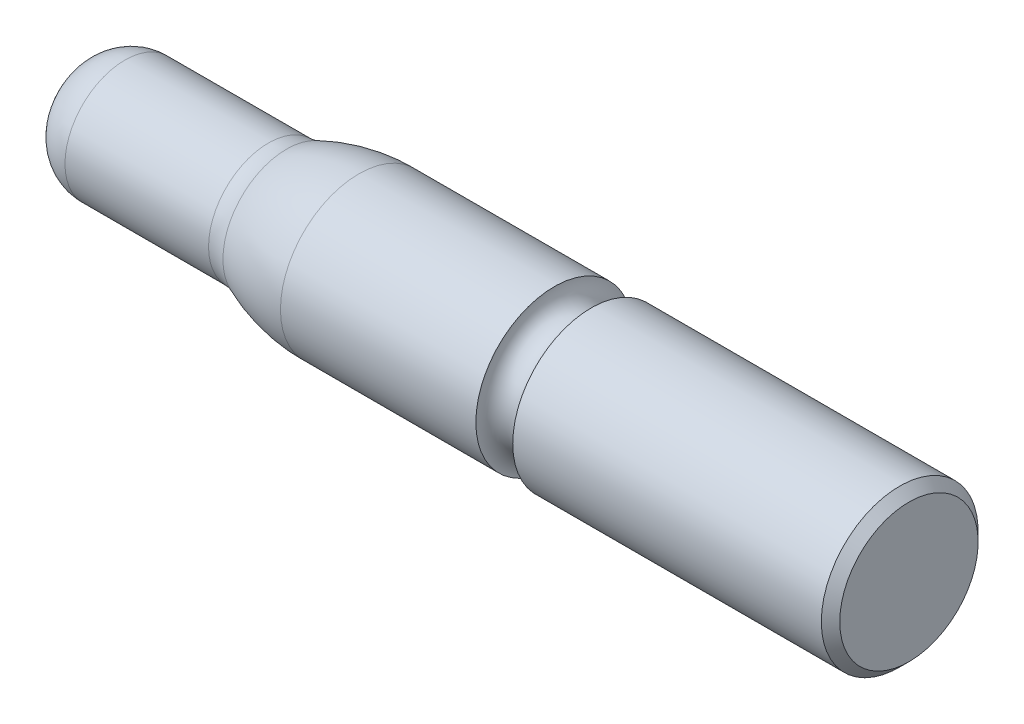
ISO-10303-21;
HEADER;
FILE_DESCRIPTION(('STEP AP214'),'2;1');
FILE_NAME('part.step','',(''),(''),'','','');
FILE_SCHEMA(('AUTOMOTIVE_DESIGN { 1 0 10303 214 1 1 1 1 }'));
ENDSEC;
DATA;
#1=APPLICATION_CONTEXT('core data for automotive mechanical design processes');
#2=APPLICATION_PROTOCOL_DEFINITION('international standard','automotive_design',2000,#1);
#3=PRODUCT_CONTEXT('',#1,'mechanical');
#4=PRODUCT('Part','Part','',(#3));
#5=PRODUCT_RELATED_PRODUCT_CATEGORY('part','',(#4));
#6=PRODUCT_DEFINITION_FORMATION('','',#4);
#7=PRODUCT_DEFINITION_CONTEXT('part definition',#1,'design');
#8=PRODUCT_DEFINITION('design','',#6,#7);
#9=PRODUCT_DEFINITION_SHAPE('','',#8);
#10=(LENGTH_UNIT() NAMED_UNIT(*) SI_UNIT(.MILLI.,.METRE.));
#11=(NAMED_UNIT(*) PLANE_ANGLE_UNIT() SI_UNIT($,.RADIAN.));
#12=(NAMED_UNIT(*) SI_UNIT($,.STERADIAN.) SOLID_ANGLE_UNIT());
#13=UNCERTAINTY_MEASURE_WITH_UNIT(LENGTH_MEASURE(1.E-05),#10,'distance_accuracy_value','');
#14=(GEOMETRIC_REPRESENTATION_CONTEXT(3) GLOBAL_UNCERTAINTY_ASSIGNED_CONTEXT((#13)) GLOBAL_UNIT_ASSIGNED_CONTEXT((#10,
#11,#12)) REPRESENTATION_CONTEXT('',''));
#15=CARTESIAN_POINT('',(0.,0.,0.));
#16=DIRECTION('',(0.,0.,1.));
#17=DIRECTION('',(1.,0.,0.));
#18=AXIS2_PLACEMENT_3D('',#15,#16,#17);
#19=CARTESIAN_POINT('',(-31.4315244509485,13.,0.));
#20=DIRECTION('',(1.,0.,0.));
#21=DIRECTION('',(0.,0.,-1.));
#22=AXIS2_PLACEMENT_3D('',#19,#20,#21);
#23=PLANE('',#22);
#24=CARTESIAN_POINT('',(-31.4315244509485,0.,0.));
#25=DIRECTION('',(1.,0.,0.));
#26=DIRECTION('',(0.,0.,-1.));
#27=AXIS2_PLACEMENT_3D('',#24,#25,#26);
#28=CIRCLE('',#27,2.99999999999999);
#29=CARTESIAN_POINT('',(-31.4315244509485,0.,-2.99999999999999));
#30=VERTEX_POINT('',#29);
#31=EDGE_CURVE('E44',#30,#30,#28,.F.);
#32=ORIENTED_EDGE('',*,*,#31,.T.);
#33=EDGE_LOOP('',(#32));
#34=FACE_BOUND('',#33,.T.);
#35=ADVANCED_FACE('F32',(#34),#23,.F.);
#36=CARTESIAN_POINT('',(0.,0.,0.));
#37=DIRECTION('',(-1.,0.,0.));
#38=DIRECTION('',(0.,0.,1.));
#39=AXIS2_PLACEMENT_3D('',#36,#37,#38);
#40=CYLINDRICAL_SURFACE('',#39,13.);
#41=CARTESIAN_POINT('',(9.69771770373363,0.,0.));
#42=DIRECTION('',(-1.,0.,0.));
#43=DIRECTION('',(0.,0.,1.));
#44=AXIS2_PLACEMENT_3D('',#41,#42,#43);
#45=CIRCLE('',#44,13.);
#46=CARTESIAN_POINT('',(9.69771770373363,0.,13.));
#47=VERTEX_POINT('',#46);
#48=EDGE_CURVE('E53',#47,#47,#45,.T.);
#49=ORIENTED_EDGE('',*,*,#48,.T.);
#50=EDGE_LOOP('',(#49));
#51=FACE_BOUND('',#50,.T.);
#52=CARTESIAN_POINT('',(-21.4315244509485,0.,0.));
#53=DIRECTION('',(1.,0.,0.));
#54=DIRECTION('',(0.,0.,-1.));
#55=AXIS2_PLACEMENT_3D('',#52,#53,#54);
#56=CIRCLE('',#55,13.);
#57=CARTESIAN_POINT('',(-21.4315244509485,0.,-13.));
#58=VERTEX_POINT('',#57);
#59=EDGE_CURVE('E56',#58,#58,#56,.T.);
#60=ORIENTED_EDGE('',*,*,#59,.T.);
#61=EDGE_LOOP('',(#60));
#62=FACE_BOUND('',#61,.T.);
#63=ADVANCED_FACE('F85',(#51,#62),#40,.T.);
#64=CARTESIAN_POINT('',(29.2936356459991,0.,0.));
#65=DIRECTION('',(-1.,0.,0.));
#66=DIRECTION('',(0.,0.,1.));
#67=AXIS2_PLACEMENT_3D('',#64,#65,#66);
#68=DEGENERATE_TOROIDAL_SURFACE('',#67,23.,40.,.F.);
#69=CARTESIAN_POINT('',(13.6169012921867,0.,0.));
#70=DIRECTION('',(1.,0.,0.));
#71=DIRECTION('',(0.,0.,-1.));
#72=AXIS2_PLACEMENT_3D('',#69,#70,#71);
#73=CIRCLE('',#72,13.8);
#74=CARTESIAN_POINT('',(13.6169012921867,0.,-13.8));
#75=VERTEX_POINT('',#74);
#76=EDGE_CURVE('E48',#75,#75,#73,.T.);
#77=ORIENTED_EDGE('',*,*,#76,.T.);
#78=EDGE_LOOP('',(#77));
#79=FACE_BOUND('',#78,.T.);
#80=CARTESIAN_POINT('',(29.2936356459991,0.,0.));
#81=DIRECTION('',(-1.,0.,0.));
#82=DIRECTION('',(0.,0.,1.));
#83=AXIS2_PLACEMENT_3D('',#80,#81,#82);
#84=CIRCLE('',#83,17.);
#85=CARTESIAN_POINT('',(29.2936356459991,0.,17.));
#86=VERTEX_POINT('',#85);
#87=EDGE_CURVE('E59',#86,#86,#84,.T.);
#88=ORIENTED_EDGE('',*,*,#87,.T.);
#89=EDGE_LOOP('',(#88));
#90=FACE_BOUND('',#89,.T.);
#91=ADVANCED_FACE('F91',(#79,#90),#68,.F.);
#92=CARTESIAN_POINT('',(0.,0.,0.));
#93=DIRECTION('',(-1.,0.,0.));
#94=DIRECTION('',(0.,0.,1.));
#95=AXIS2_PLACEMENT_3D('',#92,#93,#94);
#96=CYLINDRICAL_SURFACE('',#95,17.);
#97=ORIENTED_EDGE('',*,*,#87,.F.);
#98=EDGE_LOOP('',(#97));
#99=FACE_BOUND('',#98,.T.);
#100=CARTESIAN_POINT('',(71.6562421661397,0.,0.));
#101=DIRECTION('',(-1.,0.,0.));
#102=DIRECTION('',(0.,0.,1.));
#103=AXIS2_PLACEMENT_3D('',#100,#101,#102);
#104=CIRCLE('',#103,17.);
#105=CARTESIAN_POINT('',(71.6562421661397,0.,17.));
#106=VERTEX_POINT('',#105);
#107=EDGE_CURVE('E62',#106,#106,#104,.T.);
#108=ORIENTED_EDGE('',*,*,#107,.T.);
#109=EDGE_LOOP('',(#108));
#110=FACE_BOUND('',#109,.T.);
#111=ADVANCED_FACE('F81',(#99,#110),#96,.T.);
#112=CARTESIAN_POINT('',(75.6562421661397,0.,0.));
#113=DIRECTION('',(-1.,0.,0.));
#114=DIRECTION('',(0.,0.,1.));
#115=AXIS2_PLACEMENT_3D('',#112,#113,#114);
#116=TOROIDAL_SURFACE('',#115,17.,4.);
#117=ORIENTED_EDGE('',*,*,#107,.F.);
#118=EDGE_LOOP('',(#117));
#119=FACE_BOUND('',#118,.T.);
#120=CARTESIAN_POINT('',(79.6562421661397,0.,0.));
#121=DIRECTION('',(-1.,0.,0.));
#122=DIRECTION('',(0.,0.,1.));
#123=AXIS2_PLACEMENT_3D('',#120,#121,#122);
#124=CIRCLE('',#123,17.);
#125=CARTESIAN_POINT('',(79.6562421661397,0.,17.));
#126=VERTEX_POINT('',#125);
#127=EDGE_CURVE('E65',#126,#126,#124,.T.);
#128=ORIENTED_EDGE('',*,*,#127,.T.);
#129=EDGE_LOOP('',(#128));
#130=FACE_BOUND('',#129,.T.);
#131=ADVANCED_FACE('F69',(#119,#130),#116,.F.);
#132=CARTESIAN_POINT('',(0.,0.,0.));
#133=DIRECTION('',(-1.,0.,0.));
#134=DIRECTION('',(0.,0.,1.));
#135=AXIS2_PLACEMENT_3D('',#132,#133,#134);
#136=CYLINDRICAL_SURFACE('',#135,17.);
#137=CARTESIAN_POINT('',(146.568475549051,0.,0.));
#138=DIRECTION('',(-1.,0.,0.));
#139=DIRECTION('',(0.,0.,1.));
#140=AXIS2_PLACEMENT_3D('',#137,#138,#139);
#141=CIRCLE('',#140,17.);
#142=CARTESIAN_POINT('',(146.568475549051,0.,17.));
#143=VERTEX_POINT('',#142);
#144=EDGE_CURVE('E40',#143,#143,#141,.T.);
#145=ORIENTED_EDGE('',*,*,#144,.T.);
#146=EDGE_LOOP('',(#145));
#147=FACE_BOUND('',#146,.T.);
#148=ORIENTED_EDGE('',*,*,#127,.F.);
#149=EDGE_LOOP('',(#148));
#150=FACE_BOUND('',#149,.T.);
#151=ADVANCED_FACE('F71',(#147,#150),#136,.T.);
#152=CARTESIAN_POINT('',(148.568475549051,17.,0.));
#153=DIRECTION('',(-1.,0.,0.));
#154=DIRECTION('',(0.,0.,1.));
#155=AXIS2_PLACEMENT_3D('',#152,#153,#154);
#156=PLANE('',#155);
#157=CARTESIAN_POINT('',(148.568475549051,0.,0.));
#158=DIRECTION('',(-1.,0.,0.));
#159=DIRECTION('',(0.,0.,1.));
#160=AXIS2_PLACEMENT_3D('',#157,#158,#159);
#161=CIRCLE('',#160,15.);
#162=CARTESIAN_POINT('',(148.568475549051,0.,15.));
#163=VERTEX_POINT('',#162);
#164=EDGE_CURVE('E10',#163,#163,#161,.F.);
#165=ORIENTED_EDGE('',*,*,#164,.T.);
#166=EDGE_LOOP('',(#165));
#167=FACE_BOUND('',#166,.T.);
#168=ADVANCED_FACE('F73',(#167),#156,.F.);
#169=CARTESIAN_POINT('',(9.69771770373363,0.,0.));
#170=DIRECTION('',(-1.,0.,0.));
#171=DIRECTION('',(0.,0.,1.));
#172=AXIS2_PLACEMENT_3D('',#169,#170,#171);
#173=TOROIDAL_SURFACE('',#172,23.,10.);
#174=ORIENTED_EDGE('',*,*,#76,.F.);
#175=EDGE_LOOP('',(#174));
#176=FACE_BOUND('',#175,.T.);
#177=ORIENTED_EDGE('',*,*,#48,.F.);
#178=EDGE_LOOP('',(#177));
#179=FACE_BOUND('',#178,.T.);
#180=ADVANCED_FACE('F79',(#176,#179),#173,.F.);
#181=CARTESIAN_POINT('',(-21.4315244509485,0.,0.));
#182=DIRECTION('',(1.,0.,0.));
#183=DIRECTION('',(0.,0.,-1.));
#184=AXIS2_PLACEMENT_3D('',#181,#182,#183);
#185=DEGENERATE_TOROIDAL_SURFACE('',#184,2.99999999999999,10.,.T.);
#186=ORIENTED_EDGE('',*,*,#59,.F.);
#187=EDGE_LOOP('',(#186));
#188=FACE_BOUND('',#187,.T.);
#189=ORIENTED_EDGE('',*,*,#31,.F.);
#190=EDGE_LOOP('',(#189));
#191=FACE_BOUND('',#190,.T.);
#192=ADVANCED_FACE('F97',(#188,#191),#185,.T.);
#193=CARTESIAN_POINT('',(146.568475549051,0.,0.));
#194=DIRECTION('',(-1.,0.,0.));
#195=DIRECTION('',(0.,0.,1.));
#196=AXIS2_PLACEMENT_3D('',#193,#194,#195);
#197=CONICAL_SURFACE('',#196,17.,0.785398163397445);
#198=ORIENTED_EDGE('',*,*,#164,.F.);
#199=EDGE_LOOP('',(#198));
#200=FACE_BOUND('',#199,.T.);
#201=ORIENTED_EDGE('',*,*,#144,.F.);
#202=EDGE_LOOP('',(#201));
#203=FACE_BOUND('',#202,.T.);
#204=ADVANCED_FACE('F34',(#200,#203),#197,.T.);
#205=CLOSED_SHELL('',(#35,#63,#91,#111,#131,#151,#168,#180,#192,#204));
#206=CARTESIAN_POINT('',(75.6562421661397,0.,0.));
#207=DIRECTION('',(-1.,0.,0.));
#208=DIRECTION('',(0.,-1.,0.));
#209=AXIS2_PLACEMENT_3D('',#206,#207,#208);
#210=SPHERICAL_SURFACE('',#209,4.);
#211=CARTESIAN_POINT('',(71.6562421661397,0.,0.));
#212=VERTEX_POINT('',#211);
#213=VERTEX_LOOP('',#212);
#214=FACE_BOUND('',#213,.T.);
#215=ADVANCED_FACE('F116',(#214),#210,.F.);
#216=CLOSED_SHELL('',(#215));
#217=ORIENTED_CLOSED_SHELL('',*,#216,.T.);
#218=BREP_WITH_VOIDS('B2',#205,(#217));
#219=ADVANCED_BREP_SHAPE_REPRESENTATION('',(#18,#218),#14);
#220=SHAPE_DEFINITION_REPRESENTATION(#9,#219);
ENDSEC;
END-ISO-10303-21;
